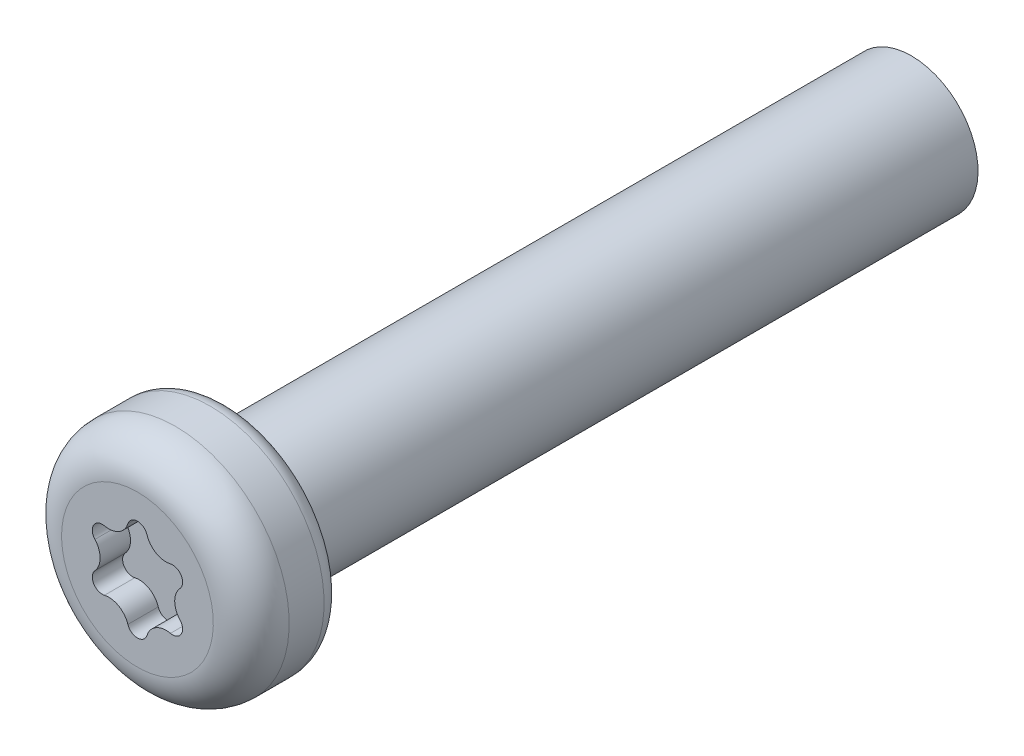
ISO-10303-21;
HEADER;
FILE_DESCRIPTION(('STEP AP214'),'2;1');
FILE_NAME('part.step','',(''),(''),'','','');
FILE_SCHEMA(('AUTOMOTIVE_DESIGN { 1 0 10303 214 1 1 1 1 }'));
ENDSEC;
DATA;
#1=APPLICATION_CONTEXT('core data for automotive mechanical design processes');
#2=APPLICATION_PROTOCOL_DEFINITION('international standard','automotive_design',2000,#1);
#3=PRODUCT_CONTEXT('',#1,'mechanical');
#4=PRODUCT('Part','Part','',(#3));
#5=PRODUCT_RELATED_PRODUCT_CATEGORY('part','',(#4));
#6=PRODUCT_DEFINITION_FORMATION('','',#4);
#7=PRODUCT_DEFINITION_CONTEXT('part definition',#1,'design');
#8=PRODUCT_DEFINITION('design','',#6,#7);
#9=PRODUCT_DEFINITION_SHAPE('','',#8);
#10=(LENGTH_UNIT() NAMED_UNIT(*) SI_UNIT(.MILLI.,.METRE.));
#11=(NAMED_UNIT(*) PLANE_ANGLE_UNIT() SI_UNIT($,.RADIAN.));
#12=(NAMED_UNIT(*) SI_UNIT($,.STERADIAN.) SOLID_ANGLE_UNIT());
#13=UNCERTAINTY_MEASURE_WITH_UNIT(LENGTH_MEASURE(1.E-05),#10,'distance_accuracy_value','');
#14=(GEOMETRIC_REPRESENTATION_CONTEXT(3) GLOBAL_UNCERTAINTY_ASSIGNED_CONTEXT((#13)) GLOBAL_UNIT_ASSIGNED_CONTEXT((#10,
#11,#12)) REPRESENTATION_CONTEXT('',''));
#15=CARTESIAN_POINT('',(0.,0.,0.));
#16=DIRECTION('',(0.,0.,1.));
#17=DIRECTION('',(1.,0.,0.));
#18=AXIS2_PLACEMENT_3D('',#15,#16,#17);
#19=CARTESIAN_POINT('',(0.,0.,1.6));
#20=DIRECTION('',(0.,0.,1.));
#21=DIRECTION('',(1.,0.,0.));
#22=AXIS2_PLACEMENT_3D('',#19,#20,#21);
#23=PLANE('',#22);
#24=CARTESIAN_POINT('',(0.,0.,1.6));
#25=DIRECTION('',(0.,0.,-1.));
#26=DIRECTION('',(0.,1.,0.));
#27=AXIS2_PLACEMENT_3D('',#24,#25,#26);
#28=CIRCLE('',#27,1.33333333333333);
#29=CARTESIAN_POINT('',(0.,1.33333333333333,1.6));
#30=VERTEX_POINT('',#29);
#31=EDGE_CURVE('E11',#30,#30,#28,.T.);
#32=ORIENTED_EDGE('',*,*,#31,.F.);
#33=EDGE_LOOP('',(#32));
#34=FACE_BOUND('',#33,.T.);
#35=CARTESIAN_POINT('',(0.503453491609989,0.87200702671645,1.6));
#36=DIRECTION('',(0.,0.,-1.));
#37=DIRECTION('',(1.,0.,0.));
#38=AXIS2_PLACEMENT_3D('',#35,#36,#37);
#39=CIRCLE('',#38,0.352);
#40=CARTESIAN_POINT('',(0.579404422438957,0.528298638535112,1.6));
#41=VERTEX_POINT('',#40);
#42=CARTESIAN_POINT('',(0.167817830536663,0.765928268164742,1.6));
#43=VERTEX_POINT('',#42);
#44=EDGE_CURVE('E83',#41,#43,#39,.T.);
#45=ORIENTED_EDGE('',*,*,#44,.F.);
#46=CARTESIAN_POINT('',(0.617379887853441,0.356444444444443,1.6));
#47=DIRECTION('',(0.,0.,1.));
#48=DIRECTION('',(-0.499999999999998,0.86602540378444,0.));
#49=AXIS2_PLACEMENT_3D('',#46,#47,#48);
#50=CIRCLE('',#49,0.176);
#51=CARTESIAN_POINT('',(0.747222252975619,0.237629629629627,1.6));
#52=VERTEX_POINT('',#51);
#53=EDGE_CURVE('E86',#52,#41,#50,.T.);
#54=ORIENTED_EDGE('',*,*,#53,.F.);
#55=CARTESIAN_POINT('',(1.00690698321998,0.,1.6));
#56=DIRECTION('',(0.,0.,-1.));
#57=DIRECTION('',(0.499999999999998,-0.86602540378444,0.));
#58=AXIS2_PLACEMENT_3D('',#55,#56,#57);
#59=CIRCLE('',#58,0.352);
#60=CARTESIAN_POINT('',(0.747222252975618,-0.237629629629633,1.6));
#61=VERTEX_POINT('',#60);
#62=EDGE_CURVE('E100',#61,#52,#59,.T.);
#63=ORIENTED_EDGE('',*,*,#62,.F.);
#64=CARTESIAN_POINT('',(0.617379887853438,-0.356444444444448,1.6));
#65=DIRECTION('',(0.,0.,1.));
#66=DIRECTION('',(0.500000000000004,0.866025403784436,0.));
#67=AXIS2_PLACEMENT_3D('',#64,#65,#66);
#68=CIRCLE('',#67,0.176);
#69=CARTESIAN_POINT('',(0.579404422438953,-0.528298638535117,1.6));
#70=VERTEX_POINT('',#69);
#71=EDGE_CURVE('E274',#70,#61,#68,.T.);
#72=ORIENTED_EDGE('',*,*,#71,.F.);
#73=CARTESIAN_POINT('',(0.503453491609983,-0.872007026716454,1.6));
#74=DIRECTION('',(0.,0.,-1.));
#75=DIRECTION('',(-0.500000000000004,-0.866025403784436,0.));
#76=AXIS2_PLACEMENT_3D('',#73,#74,#75);
#77=CIRCLE('',#76,0.352);
#78=CARTESIAN_POINT('',(0.167817830536658,-0.765928268164744,1.6));
#79=VERTEX_POINT('',#78);
#80=EDGE_CURVE('E267',#79,#70,#77,.T.);
#81=ORIENTED_EDGE('',*,*,#80,.F.);
#82=CARTESIAN_POINT('',(0.,-0.712888888888889,1.6));
#83=DIRECTION('',(0.,0.,1.));
#84=DIRECTION('',(1.,0.,0.));
#85=AXIS2_PLACEMENT_3D('',#82,#83,#84);
#86=CIRCLE('',#85,0.176);
#87=CARTESIAN_POINT('',(-0.167817830536668,-0.765928268164742,1.6));
#88=VERTEX_POINT('',#87);
#89=EDGE_CURVE('E256',#88,#79,#86,.T.);
#90=ORIENTED_EDGE('',*,*,#89,.F.);
#91=CARTESIAN_POINT('',(-0.503453491609995,-0.872007026716447,1.6));
#92=DIRECTION('',(0.,0.,-1.));
#93=DIRECTION('',(-1.,0.,0.));
#94=AXIS2_PLACEMENT_3D('',#91,#92,#93);
#95=CIRCLE('',#94,0.352);
#96=CARTESIAN_POINT('',(-0.57940442243896,-0.528298638535108,1.6));
#97=VERTEX_POINT('',#96);
#98=EDGE_CURVE('E249',#97,#88,#95,.T.);
#99=ORIENTED_EDGE('',*,*,#98,.F.);
#100=CARTESIAN_POINT('',(-0.617379887853443,-0.356444444444439,1.6));
#101=DIRECTION('',(0.,0.,1.));
#102=DIRECTION('',(0.499999999999992,-0.866025403784443,0.));
#103=AXIS2_PLACEMENT_3D('',#100,#101,#102);
#104=CIRCLE('',#103,0.176);
#105=CARTESIAN_POINT('',(-0.747222252975621,-0.237629629629622,1.6));
#106=VERTEX_POINT('',#105);
#107=EDGE_CURVE('E238',#106,#97,#104,.T.);
#108=ORIENTED_EDGE('',*,*,#107,.F.);
#109=CARTESIAN_POINT('',(-1.00690698321998,0.,1.6));
#110=DIRECTION('',(0.,0.,-1.));
#111=DIRECTION('',(-0.499999999999992,0.866025403784443,0.));
#112=AXIS2_PLACEMENT_3D('',#109,#110,#111);
#113=CIRCLE('',#112,0.352);
#114=CARTESIAN_POINT('',(-0.747222252975616,0.237629629629638,1.6));
#115=VERTEX_POINT('',#114);
#116=EDGE_CURVE('E231',#115,#106,#113,.T.);
#117=ORIENTED_EDGE('',*,*,#116,.F.);
#118=CARTESIAN_POINT('',(-0.617379887853436,0.356444444444452,1.6));
#119=DIRECTION('',(0.,0.,1.));
#120=DIRECTION('',(-0.50000000000001,-0.866025403784433,0.));
#121=AXIS2_PLACEMENT_3D('',#118,#119,#120);
#122=CIRCLE('',#121,0.176);
#123=CARTESIAN_POINT('',(-0.579404422438949,0.52829863853512,1.6));
#124=VERTEX_POINT('',#123);
#125=EDGE_CURVE('E219',#124,#115,#122,.T.);
#126=ORIENTED_EDGE('',*,*,#125,.F.);
#127=CARTESIAN_POINT('',(-0.503453491609989,0.87200702671645,1.6));
#128=DIRECTION('',(0.,0.,-1.));
#129=DIRECTION('',(1.,0.,0.));
#130=AXIS2_PLACEMENT_3D('',#127,#128,#129);
#131=CIRCLE('',#130,0.352);
#132=CARTESIAN_POINT('',(-0.167817830536663,0.765928268164742,1.6));
#133=VERTEX_POINT('',#132);
#134=EDGE_CURVE('E112',#133,#124,#131,.T.);
#135=ORIENTED_EDGE('',*,*,#134,.F.);
#136=CARTESIAN_POINT('',(0.,0.712888888888889,1.6));
#137=DIRECTION('',(0.,0.,1.));
#138=DIRECTION('',(-1.,0.,0.));
#139=AXIS2_PLACEMENT_3D('',#136,#137,#138);
#140=CIRCLE('',#139,0.176);
#141=EDGE_CURVE('E88',#43,#133,#140,.T.);
#142=ORIENTED_EDGE('',*,*,#141,.F.);
#143=EDGE_LOOP('',(#45,#54,#63,#72,#81,#90,#99,#108,#117,#126,#135,#142));
#144=FACE_BOUND('',#143,.T.);
#145=ADVANCED_FACE('F36',(#34,#144),#23,.T.);
#146=CARTESIAN_POINT('',(0.,0.,0.));
#147=DIRECTION('',(0.,0.,1.));
#148=DIRECTION('',(1.,0.,0.));
#149=AXIS2_PLACEMENT_3D('',#146,#147,#148);
#150=PLANE('',#149);
#151=CARTESIAN_POINT('',(0.,0.,0.));
#152=DIRECTION('',(0.,0.,-1.));
#153=DIRECTION('',(0.,1.,0.));
#154=AXIS2_PLACEMENT_3D('',#151,#152,#153);
#155=CIRCLE('',#154,1.17);
#156=CARTESIAN_POINT('',(0.,1.17,0.));
#157=VERTEX_POINT('',#156);
#158=EDGE_CURVE('E216',#157,#157,#155,.T.);
#159=ORIENTED_EDGE('',*,*,#158,.F.);
#160=EDGE_LOOP('',(#159));
#161=FACE_BOUND('',#160,.T.);
#162=CARTESIAN_POINT('',(0.,0.,0.));
#163=DIRECTION('',(0.,0.,-1.));
#164=DIRECTION('',(0.,1.,0.));
#165=AXIS2_PLACEMENT_3D('',#162,#163,#164);
#166=CIRCLE('',#165,1.68);
#167=CARTESIAN_POINT('',(0.,1.68,0.));
#168=VERTEX_POINT('',#167);
#169=EDGE_CURVE('E45',#168,#168,#166,.T.);
#170=ORIENTED_EDGE('',*,*,#169,.T.);
#171=EDGE_LOOP('',(#170));
#172=FACE_BOUND('',#171,.T.);
#173=ADVANCED_FACE('F131',(#161,#172),#150,.F.);
#174=CARTESIAN_POINT('',(0.,0.,0.32));
#175=DIRECTION('',(0.,0.,-1.));
#176=DIRECTION('',(0.,1.,0.));
#177=AXIS2_PLACEMENT_3D('',#174,#175,#176);
#178=TOROIDAL_SURFACE('',#177,1.68,0.32);
#179=ORIENTED_EDGE('',*,*,#169,.F.);
#180=EDGE_LOOP('',(#179));
#181=FACE_BOUND('',#180,.T.);
#182=CARTESIAN_POINT('',(0.,0.,0.32));
#183=DIRECTION('',(0.,0.,-1.));
#184=DIRECTION('',(0.,1.,0.));
#185=AXIS2_PLACEMENT_3D('',#182,#183,#184);
#186=CIRCLE('',#185,2.);
#187=CARTESIAN_POINT('',(0.,2.,0.32));
#188=VERTEX_POINT('',#187);
#189=EDGE_CURVE('E126',#188,#188,#186,.T.);
#190=ORIENTED_EDGE('',*,*,#189,.T.);
#191=EDGE_LOOP('',(#190));
#192=FACE_BOUND('',#191,.T.);
#193=ADVANCED_FACE('F133',(#181,#192),#178,.T.);
#194=CARTESIAN_POINT('',(0.,0.,1.6));
#195=DIRECTION('',(0.,0.,-1.));
#196=DIRECTION('',(-1.,0.,0.));
#197=AXIS2_PLACEMENT_3D('',#194,#195,#196);
#198=CYLINDRICAL_SURFACE('',#197,2.);
#199=CARTESIAN_POINT('',(0.,0.,0.933333333333333));
#200=DIRECTION('',(0.,0.,-1.));
#201=DIRECTION('',(0.,1.,0.));
#202=AXIS2_PLACEMENT_3D('',#199,#200,#201);
#203=CIRCLE('',#202,2.);
#204=CARTESIAN_POINT('',(0.,2.,0.933333333333333));
#205=VERTEX_POINT('',#204);
#206=EDGE_CURVE('E122',#205,#205,#203,.T.);
#207=ORIENTED_EDGE('',*,*,#206,.T.);
#208=EDGE_LOOP('',(#207));
#209=FACE_BOUND('',#208,.T.);
#210=ORIENTED_EDGE('',*,*,#189,.F.);
#211=EDGE_LOOP('',(#210));
#212=FACE_BOUND('',#211,.T.);
#213=ADVANCED_FACE('F38',(#209,#212),#198,.T.);
#214=CARTESIAN_POINT('',(0.,0.,0.933333333333333));
#215=DIRECTION('',(0.,0.,-1.));
#216=DIRECTION('',(0.,1.,0.));
#217=AXIS2_PLACEMENT_3D('',#214,#215,#216);
#218=TOROIDAL_SURFACE('',#217,1.33333333333333,0.666666666666667);
#219=ORIENTED_EDGE('',*,*,#206,.F.);
#220=EDGE_LOOP('',(#219));
#221=FACE_BOUND('',#220,.T.);
#222=ORIENTED_EDGE('',*,*,#31,.T.);
#223=EDGE_LOOP('',(#222));
#224=FACE_BOUND('',#223,.T.);
#225=ADVANCED_FACE('F140',(#221,#224),#218,.T.);
#226=CARTESIAN_POINT('',(-0.503453491609989,0.87200702671645,1.06666666666667));
#227=DIRECTION('',(0.,0.,1.));
#228=DIRECTION('',(1.,0.,0.));
#229=AXIS2_PLACEMENT_3D('',#226,#227,#228);
#230=CYLINDRICAL_SURFACE('',#229,0.352);
#231=ORIENTED_EDGE('',*,*,#134,.T.);
#232=DIRECTION('',(0.,0.,1.));
#233=VECTOR('',#232,1.);
#234=CARTESIAN_POINT('',(-0.579404422438949,0.52829863853512,1.06666666666667));
#235=LINE('',#234,#233);
#236=CARTESIAN_POINT('',(-0.579404422438949,0.52829863853512,1.06666666666667));
#237=VERTEX_POINT('',#236);
#238=EDGE_CURVE('E225',#237,#124,#235,.T.);
#239=ORIENTED_EDGE('',*,*,#238,.F.);
#240=CARTESIAN_POINT('',(-0.503453491609989,0.87200702671645,1.06666666666667));
#241=DIRECTION('',(0.,0.,-1.));
#242=DIRECTION('',(1.,0.,0.));
#243=AXIS2_PLACEMENT_3D('',#240,#241,#242);
#244=CIRCLE('',#243,0.352);
#245=CARTESIAN_POINT('',(-0.167817830536663,0.765928268164742,1.06666666666667));
#246=VERTEX_POINT('',#245);
#247=EDGE_CURVE('E115',#246,#237,#244,.T.);
#248=ORIENTED_EDGE('',*,*,#247,.F.);
#249=DIRECTION('',(0.,0.,1.));
#250=VECTOR('',#249,1.);
#251=CARTESIAN_POINT('',(-0.167817830536663,0.765928268164742,1.06666666666667));
#252=LINE('',#251,#250);
#253=EDGE_CURVE('E53',#246,#133,#252,.T.);
#254=ORIENTED_EDGE('',*,*,#253,.T.);
#255=EDGE_LOOP('',(#231,#239,#248,#254));
#256=FACE_BOUND('',#255,.T.);
#257=ADVANCED_FACE('F145',(#256),#230,.T.);
#258=CARTESIAN_POINT('',(0.,0.712888888888889,1.06666666666667));
#259=DIRECTION('',(0.,0.,1.));
#260=DIRECTION('',(1.,0.,0.));
#261=AXIS2_PLACEMENT_3D('',#258,#259,#260);
#262=CYLINDRICAL_SURFACE('',#261,0.176);
#263=ORIENTED_EDGE('',*,*,#141,.T.);
#264=ORIENTED_EDGE('',*,*,#253,.F.);
#265=CARTESIAN_POINT('',(0.,0.712888888888889,1.06666666666667));
#266=DIRECTION('',(0.,0.,1.));
#267=DIRECTION('',(-1.,0.,0.));
#268=AXIS2_PLACEMENT_3D('',#265,#266,#267);
#269=CIRCLE('',#268,0.176);
#270=CARTESIAN_POINT('',(0.167817830536663,0.765928268164742,1.06666666666667));
#271=VERTEX_POINT('',#270);
#272=EDGE_CURVE('E111',#271,#246,#269,.T.);
#273=ORIENTED_EDGE('',*,*,#272,.F.);
#274=DIRECTION('',(0.,0.,1.));
#275=VECTOR('',#274,1.);
#276=CARTESIAN_POINT('',(0.167817830536663,0.765928268164742,1.06666666666667));
#277=LINE('',#276,#275);
#278=EDGE_CURVE('E61',#271,#43,#277,.T.);
#279=ORIENTED_EDGE('',*,*,#278,.T.);
#280=EDGE_LOOP('',(#263,#264,#273,#279));
#281=FACE_BOUND('',#280,.T.);
#282=ADVANCED_FACE('F160',(#281),#262,.F.);
#283=CARTESIAN_POINT('',(0.503453491609989,0.87200702671645,1.06666666666667));
#284=DIRECTION('',(0.,0.,1.));
#285=DIRECTION('',(1.,0.,0.));
#286=AXIS2_PLACEMENT_3D('',#283,#284,#285);
#287=CYLINDRICAL_SURFACE('',#286,0.352);
#288=ORIENTED_EDGE('',*,*,#44,.T.);
#289=ORIENTED_EDGE('',*,*,#278,.F.);
#290=CARTESIAN_POINT('',(0.503453491609989,0.87200702671645,1.06666666666667));
#291=DIRECTION('',(0.,0.,-1.));
#292=DIRECTION('',(1.,0.,0.));
#293=AXIS2_PLACEMENT_3D('',#290,#291,#292);
#294=CIRCLE('',#293,0.352);
#295=CARTESIAN_POINT('',(0.579404422438957,0.528298638535112,1.06666666666667));
#296=VERTEX_POINT('',#295);
#297=EDGE_CURVE('E69',#296,#271,#294,.T.);
#298=ORIENTED_EDGE('',*,*,#297,.F.);
#299=DIRECTION('',(0.,0.,1.));
#300=VECTOR('',#299,1.);
#301=CARTESIAN_POINT('',(0.579404422438957,0.528298638535112,1.06666666666667));
#302=LINE('',#301,#300);
#303=EDGE_CURVE('E89',#296,#41,#302,.T.);
#304=ORIENTED_EDGE('',*,*,#303,.T.);
#305=EDGE_LOOP('',(#288,#289,#298,#304));
#306=FACE_BOUND('',#305,.T.);
#307=ADVANCED_FACE('F91',(#306),#287,.T.);
#308=CARTESIAN_POINT('',(0.503453491609989,0.87200702671645,1.06666666666667));
#309=DIRECTION('',(0.,0.,1.));
#310=DIRECTION('',(1.,0.,0.));
#311=AXIS2_PLACEMENT_3D('',#308,#309,#310);
#312=PLANE('',#311);
#313=CARTESIAN_POINT('',(0.617379887853441,0.356444444444443,1.06666666666667));
#314=DIRECTION('',(0.,0.,1.));
#315=DIRECTION('',(-0.499999999999998,0.86602540378444,0.));
#316=AXIS2_PLACEMENT_3D('',#313,#314,#315);
#317=CIRCLE('',#316,0.176);
#318=CARTESIAN_POINT('',(0.747222252975619,0.237629629629627,1.06666666666667));
#319=VERTEX_POINT('',#318);
#320=EDGE_CURVE('E103',#319,#296,#317,.T.);
#321=ORIENTED_EDGE('',*,*,#320,.T.);
#322=ORIENTED_EDGE('',*,*,#297,.T.);
#323=ORIENTED_EDGE('',*,*,#272,.T.);
#324=ORIENTED_EDGE('',*,*,#247,.T.);
#325=CARTESIAN_POINT('',(-0.617379887853436,0.356444444444452,1.06666666666667));
#326=DIRECTION('',(0.,0.,1.));
#327=DIRECTION('',(-0.50000000000001,-0.866025403784433,0.));
#328=AXIS2_PLACEMENT_3D('',#325,#326,#327);
#329=CIRCLE('',#328,0.176);
#330=CARTESIAN_POINT('',(-0.747222252975616,0.237629629629638,1.06666666666667));
#331=VERTEX_POINT('',#330);
#332=EDGE_CURVE('E222',#237,#331,#329,.T.);
#333=ORIENTED_EDGE('',*,*,#332,.T.);
#334=CARTESIAN_POINT('',(-1.00690698321998,0.,1.06666666666667));
#335=DIRECTION('',(0.,0.,-1.));
#336=DIRECTION('',(-0.499999999999992,0.866025403784443,0.));
#337=AXIS2_PLACEMENT_3D('',#334,#335,#336);
#338=CIRCLE('',#337,0.352);
#339=CARTESIAN_POINT('',(-0.747222252975621,-0.237629629629622,1.06666666666667));
#340=VERTEX_POINT('',#339);
#341=EDGE_CURVE('E234',#331,#340,#338,.T.);
#342=ORIENTED_EDGE('',*,*,#341,.T.);
#343=CARTESIAN_POINT('',(-0.617379887853443,-0.356444444444439,1.06666666666667));
#344=DIRECTION('',(0.,0.,1.));
#345=DIRECTION('',(0.499999999999992,-0.866025403784443,0.));
#346=AXIS2_PLACEMENT_3D('',#343,#344,#345);
#347=CIRCLE('',#346,0.176);
#348=CARTESIAN_POINT('',(-0.57940442243896,-0.528298638535108,1.06666666666667));
#349=VERTEX_POINT('',#348);
#350=EDGE_CURVE('E237',#340,#349,#347,.T.);
#351=ORIENTED_EDGE('',*,*,#350,.T.);
#352=CARTESIAN_POINT('',(-0.503453491609995,-0.872007026716446,1.06666666666667));
#353=DIRECTION('',(0.,0.,-1.));
#354=DIRECTION('',(-1.,0.,0.));
#355=AXIS2_PLACEMENT_3D('',#352,#353,#354);
#356=CIRCLE('',#355,0.352);
#357=CARTESIAN_POINT('',(-0.167817830536668,-0.765928268164742,1.06666666666667));
#358=VERTEX_POINT('',#357);
#359=EDGE_CURVE('E252',#349,#358,#356,.T.);
#360=ORIENTED_EDGE('',*,*,#359,.T.);
#361=CARTESIAN_POINT('',(0.,-0.712888888888889,1.06666666666667));
#362=DIRECTION('',(0.,0.,1.));
#363=DIRECTION('',(1.,0.,0.));
#364=AXIS2_PLACEMENT_3D('',#361,#362,#363);
#365=CIRCLE('',#364,0.176);
#366=CARTESIAN_POINT('',(0.167817830536658,-0.765928268164744,1.06666666666667));
#367=VERTEX_POINT('',#366);
#368=EDGE_CURVE('E255',#358,#367,#365,.T.);
#369=ORIENTED_EDGE('',*,*,#368,.T.);
#370=CARTESIAN_POINT('',(0.503453491609983,-0.872007026716454,1.06666666666667));
#371=DIRECTION('',(0.,0.,-1.));
#372=DIRECTION('',(-0.500000000000004,-0.866025403784436,0.));
#373=AXIS2_PLACEMENT_3D('',#370,#371,#372);
#374=CIRCLE('',#373,0.352);
#375=CARTESIAN_POINT('',(0.579404422438953,-0.528298638535116,1.06666666666667));
#376=VERTEX_POINT('',#375);
#377=EDGE_CURVE('E270',#367,#376,#374,.T.);
#378=ORIENTED_EDGE('',*,*,#377,.T.);
#379=CARTESIAN_POINT('',(0.617379887853438,-0.356444444444448,1.06666666666667));
#380=DIRECTION('',(0.,0.,1.));
#381=DIRECTION('',(0.500000000000004,0.866025403784436,0.));
#382=AXIS2_PLACEMENT_3D('',#379,#380,#381);
#383=CIRCLE('',#382,0.176);
#384=CARTESIAN_POINT('',(0.747222252975618,-0.237629629629633,1.06666666666667));
#385=VERTEX_POINT('',#384);
#386=EDGE_CURVE('E273',#376,#385,#383,.T.);
#387=ORIENTED_EDGE('',*,*,#386,.T.);
#388=CARTESIAN_POINT('',(1.00690698321998,0.,1.06666666666667));
#389=DIRECTION('',(0.,0.,-1.));
#390=DIRECTION('',(0.499999999999998,-0.86602540378444,0.));
#391=AXIS2_PLACEMENT_3D('',#388,#389,#390);
#392=CIRCLE('',#391,0.352);
#393=EDGE_CURVE('E99',#385,#319,#392,.T.);
#394=ORIENTED_EDGE('',*,*,#393,.T.);
#395=EDGE_LOOP('',(#321,#322,#323,#324,#333,#342,#351,#360,#369,#378,#387,#394));
#396=FACE_BOUND('',#395,.T.);
#397=ADVANCED_FACE('F159',(#396),#312,.T.);
#398=CARTESIAN_POINT('',(0.617379887853441,0.356444444444443,1.06666666666667));
#399=DIRECTION('',(0.,0.,1.));
#400=DIRECTION('',(1.,0.,0.));
#401=AXIS2_PLACEMENT_3D('',#398,#399,#400);
#402=CYLINDRICAL_SURFACE('',#401,0.176);
#403=ORIENTED_EDGE('',*,*,#53,.T.);
#404=ORIENTED_EDGE('',*,*,#303,.F.);
#405=ORIENTED_EDGE('',*,*,#320,.F.);
#406=DIRECTION('',(0.,0.,1.));
#407=VECTOR('',#406,1.);
#408=CARTESIAN_POINT('',(0.747222252975619,0.237629629629627,1.06666666666667));
#409=LINE('',#408,#407);
#410=EDGE_CURVE('E95',#319,#52,#409,.T.);
#411=ORIENTED_EDGE('',*,*,#410,.T.);
#412=EDGE_LOOP('',(#403,#404,#405,#411));
#413=FACE_BOUND('',#412,.T.);
#414=ADVANCED_FACE('F97',(#413),#402,.F.);
#415=CARTESIAN_POINT('',(1.00690698321998,0.,1.06666666666667));
#416=DIRECTION('',(0.,0.,1.));
#417=DIRECTION('',(1.,0.,0.));
#418=AXIS2_PLACEMENT_3D('',#415,#416,#417);
#419=CYLINDRICAL_SURFACE('',#418,0.352);
#420=ORIENTED_EDGE('',*,*,#62,.T.);
#421=ORIENTED_EDGE('',*,*,#410,.F.);
#422=ORIENTED_EDGE('',*,*,#393,.F.);
#423=DIRECTION('',(0.,0.,1.));
#424=VECTOR('',#423,1.);
#425=CARTESIAN_POINT('',(0.747222252975618,-0.237629629629633,1.06666666666667));
#426=LINE('',#425,#424);
#427=EDGE_CURVE('E105',#385,#61,#426,.T.);
#428=ORIENTED_EDGE('',*,*,#427,.T.);
#429=EDGE_LOOP('',(#420,#421,#422,#428));
#430=FACE_BOUND('',#429,.T.);
#431=ADVANCED_FACE('F169',(#430),#419,.T.);
#432=CARTESIAN_POINT('',(0.617379887853438,-0.356444444444448,1.06666666666667));
#433=DIRECTION('',(0.,0.,1.));
#434=DIRECTION('',(0.,-1.,0.));
#435=AXIS2_PLACEMENT_3D('',#432,#433,#434);
#436=CYLINDRICAL_SURFACE('',#435,0.176);
#437=ORIENTED_EDGE('',*,*,#71,.T.);
#438=ORIENTED_EDGE('',*,*,#427,.F.);
#439=ORIENTED_EDGE('',*,*,#386,.F.);
#440=DIRECTION('',(0.,0.,1.));
#441=VECTOR('',#440,1.);
#442=CARTESIAN_POINT('',(0.579404422438953,-0.528298638535116,1.06666666666667));
#443=LINE('',#442,#441);
#444=EDGE_CURVE('E277',#376,#70,#443,.T.);
#445=ORIENTED_EDGE('',*,*,#444,.T.);
#446=EDGE_LOOP('',(#437,#438,#439,#445));
#447=FACE_BOUND('',#446,.T.);
#448=ADVANCED_FACE('F172',(#447),#436,.F.);
#449=CARTESIAN_POINT('',(0.503453491609983,-0.872007026716454,1.06666666666667));
#450=DIRECTION('',(0.,0.,1.));
#451=DIRECTION('',(0.,-1.,0.));
#452=AXIS2_PLACEMENT_3D('',#449,#450,#451);
#453=CYLINDRICAL_SURFACE('',#452,0.352);
#454=ORIENTED_EDGE('',*,*,#80,.T.);
#455=ORIENTED_EDGE('',*,*,#444,.F.);
#456=ORIENTED_EDGE('',*,*,#377,.F.);
#457=DIRECTION('',(0.,0.,1.));
#458=VECTOR('',#457,1.);
#459=CARTESIAN_POINT('',(0.167817830536658,-0.765928268164744,1.06666666666667));
#460=LINE('',#459,#458);
#461=EDGE_CURVE('E264',#367,#79,#460,.T.);
#462=ORIENTED_EDGE('',*,*,#461,.T.);
#463=EDGE_LOOP('',(#454,#455,#456,#462));
#464=FACE_BOUND('',#463,.T.);
#465=ADVANCED_FACE('F176',(#464),#453,.T.);
#466=CARTESIAN_POINT('',(0.,-0.712888888888889,1.06666666666667));
#467=DIRECTION('',(0.,0.,1.));
#468=DIRECTION('',(0.,-1.,0.));
#469=AXIS2_PLACEMENT_3D('',#466,#467,#468);
#470=CYLINDRICAL_SURFACE('',#469,0.176);
#471=ORIENTED_EDGE('',*,*,#89,.T.);
#472=ORIENTED_EDGE('',*,*,#461,.F.);
#473=ORIENTED_EDGE('',*,*,#368,.F.);
#474=DIRECTION('',(0.,0.,1.));
#475=VECTOR('',#474,1.);
#476=CARTESIAN_POINT('',(-0.167817830536668,-0.765928268164742,1.06666666666667));
#477=LINE('',#476,#475);
#478=EDGE_CURVE('E259',#358,#88,#477,.T.);
#479=ORIENTED_EDGE('',*,*,#478,.T.);
#480=EDGE_LOOP('',(#471,#472,#473,#479));
#481=FACE_BOUND('',#480,.T.);
#482=ADVANCED_FACE('F179',(#481),#470,.F.);
#483=CARTESIAN_POINT('',(-0.503453491609995,-0.872007026716446,1.06666666666667));
#484=DIRECTION('',(0.,0.,1.));
#485=DIRECTION('',(0.,-1.,0.));
#486=AXIS2_PLACEMENT_3D('',#483,#484,#485);
#487=CYLINDRICAL_SURFACE('',#486,0.352);
#488=ORIENTED_EDGE('',*,*,#98,.T.);
#489=ORIENTED_EDGE('',*,*,#478,.F.);
#490=ORIENTED_EDGE('',*,*,#359,.F.);
#491=DIRECTION('',(0.,0.,1.));
#492=VECTOR('',#491,1.);
#493=CARTESIAN_POINT('',(-0.57940442243896,-0.528298638535108,1.06666666666667));
#494=LINE('',#493,#492);
#495=EDGE_CURVE('E246',#349,#97,#494,.T.);
#496=ORIENTED_EDGE('',*,*,#495,.T.);
#497=EDGE_LOOP('',(#488,#489,#490,#496));
#498=FACE_BOUND('',#497,.T.);
#499=ADVANCED_FACE('F184',(#498),#487,.T.);
#500=CARTESIAN_POINT('',(-0.617379887853443,-0.356444444444439,1.06666666666667));
#501=DIRECTION('',(0.,0.,1.));
#502=DIRECTION('',(0.,-1.,0.));
#503=AXIS2_PLACEMENT_3D('',#500,#501,#502);
#504=CYLINDRICAL_SURFACE('',#503,0.176);
#505=ORIENTED_EDGE('',*,*,#107,.T.);
#506=ORIENTED_EDGE('',*,*,#495,.F.);
#507=ORIENTED_EDGE('',*,*,#350,.F.);
#508=DIRECTION('',(0.,0.,1.));
#509=VECTOR('',#508,1.);
#510=CARTESIAN_POINT('',(-0.747222252975621,-0.237629629629622,1.06666666666667));
#511=LINE('',#510,#509);
#512=EDGE_CURVE('E241',#340,#106,#511,.T.);
#513=ORIENTED_EDGE('',*,*,#512,.T.);
#514=EDGE_LOOP('',(#505,#506,#507,#513));
#515=FACE_BOUND('',#514,.T.);
#516=ADVANCED_FACE('F187',(#515),#504,.F.);
#517=CARTESIAN_POINT('',(-1.00690698321998,0.,1.06666666666667));
#518=DIRECTION('',(0.,0.,1.));
#519=DIRECTION('',(0.,-1.,0.));
#520=AXIS2_PLACEMENT_3D('',#517,#518,#519);
#521=CYLINDRICAL_SURFACE('',#520,0.352);
#522=ORIENTED_EDGE('',*,*,#116,.T.);
#523=ORIENTED_EDGE('',*,*,#512,.F.);
#524=ORIENTED_EDGE('',*,*,#341,.F.);
#525=DIRECTION('',(0.,0.,1.));
#526=VECTOR('',#525,1.);
#527=CARTESIAN_POINT('',(-0.747222252975616,0.237629629629638,1.06666666666667));
#528=LINE('',#527,#526);
#529=EDGE_CURVE('E228',#331,#115,#528,.T.);
#530=ORIENTED_EDGE('',*,*,#529,.T.);
#531=EDGE_LOOP('',(#522,#523,#524,#530));
#532=FACE_BOUND('',#531,.T.);
#533=ADVANCED_FACE('F192',(#532),#521,.T.);
#534=CARTESIAN_POINT('',(-0.617379887853436,0.356444444444452,1.06666666666667));
#535=DIRECTION('',(0.,0.,1.));
#536=DIRECTION('',(1.,0.,0.));
#537=AXIS2_PLACEMENT_3D('',#534,#535,#536);
#538=CYLINDRICAL_SURFACE('',#537,0.176);
#539=ORIENTED_EDGE('',*,*,#125,.T.);
#540=ORIENTED_EDGE('',*,*,#529,.F.);
#541=ORIENTED_EDGE('',*,*,#332,.F.);
#542=ORIENTED_EDGE('',*,*,#238,.T.);
#543=EDGE_LOOP('',(#539,#540,#541,#542));
#544=FACE_BOUND('',#543,.T.);
#545=ADVANCED_FACE('F195',(#544),#538,.F.);
#546=CARTESIAN_POINT('',(0.,0.,0.));
#547=DIRECTION('',(0.,0.,-1.));
#548=DIRECTION('',(0.,1.,0.));
#549=AXIS2_PLACEMENT_3D('',#546,#547,#548);
#550=CYLINDRICAL_SURFACE('',#549,1.17);
#551=ORIENTED_EDGE('',*,*,#158,.T.);
#552=EDGE_LOOP('',(#551));
#553=FACE_BOUND('',#552,.T.);
#554=CARTESIAN_POINT('',(0.,0.,-12.));
#555=DIRECTION('',(0.,0.,-1.));
#556=DIRECTION('',(0.,1.,0.));
#557=AXIS2_PLACEMENT_3D('',#554,#555,#556);
#558=CIRCLE('',#557,1.17);
#559=CARTESIAN_POINT('',(0.,1.17,-12.));
#560=VERTEX_POINT('',#559);
#561=EDGE_CURVE('E214',#560,#560,#558,.T.);
#562=ORIENTED_EDGE('',*,*,#561,.F.);
#563=EDGE_LOOP('',(#562));
#564=FACE_BOUND('',#563,.T.);
#565=ADVANCED_FACE('F202',(#553,#564),#550,.T.);
#566=CARTESIAN_POINT('',(0.,0.,-12.));
#567=DIRECTION('',(0.,0.,-1.));
#568=DIRECTION('',(0.,1.,0.));
#569=AXIS2_PLACEMENT_3D('',#566,#567,#568);
#570=PLANE('',#569);
#571=ORIENTED_EDGE('',*,*,#561,.T.);
#572=EDGE_LOOP('',(#571));
#573=FACE_BOUND('',#572,.T.);
#574=ADVANCED_FACE('F206',(#573),#570,.T.);
#575=CLOSED_SHELL('',(#145,#173,#193,#213,#225,#257,#282,#307,#397,#414,#431,#448,#465,#482,
#499,#516,#533,#545,#565,#574));
#576=MANIFOLD_SOLID_BREP('B2',#575);
#577=ADVANCED_BREP_SHAPE_REPRESENTATION('',(#18,#576),#14);
#578=SHAPE_DEFINITION_REPRESENTATION(#9,#577);
ENDSEC;
END-ISO-10303-21;
